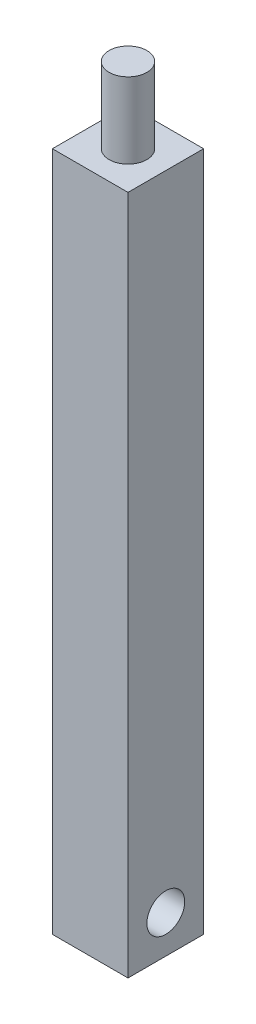
ISO-10303-21;
HEADER;
FILE_DESCRIPTION(('STEP AP214'),'2;1');
FILE_NAME('part.step','',(''),(''),'','','');
FILE_SCHEMA(('AUTOMOTIVE_DESIGN { 1 0 10303 214 1 1 1 1 }'));
ENDSEC;
DATA;
#1=APPLICATION_CONTEXT('core data for automotive mechanical design processes');
#2=APPLICATION_PROTOCOL_DEFINITION('international standard','automotive_design',2000,#1);
#3=PRODUCT_CONTEXT('',#1,'mechanical');
#4=PRODUCT('Part','Part','',(#3));
#5=PRODUCT_RELATED_PRODUCT_CATEGORY('part','',(#4));
#6=PRODUCT_DEFINITION_FORMATION('','',#4);
#7=PRODUCT_DEFINITION_CONTEXT('part definition',#1,'design');
#8=PRODUCT_DEFINITION('design','',#6,#7);
#9=PRODUCT_DEFINITION_SHAPE('','',#8);
#10=(LENGTH_UNIT() NAMED_UNIT(*) SI_UNIT(.MILLI.,.METRE.));
#11=(NAMED_UNIT(*) PLANE_ANGLE_UNIT() SI_UNIT($,.RADIAN.));
#12=(NAMED_UNIT(*) SI_UNIT($,.STERADIAN.) SOLID_ANGLE_UNIT());
#13=UNCERTAINTY_MEASURE_WITH_UNIT(LENGTH_MEASURE(1.E-05),#10,'distance_accuracy_value','');
#14=(GEOMETRIC_REPRESENTATION_CONTEXT(3) GLOBAL_UNCERTAINTY_ASSIGNED_CONTEXT((#13)) GLOBAL_UNIT_ASSIGNED_CONTEXT((#10,
#11,#12)) REPRESENTATION_CONTEXT('',''));
#15=CARTESIAN_POINT('',(0.,0.,0.));
#16=DIRECTION('',(0.,0.,1.));
#17=DIRECTION('',(1.,0.,0.));
#18=AXIS2_PLACEMENT_3D('',#15,#16,#17);
#19=CARTESIAN_POINT('',(5.,90.,-5.));
#20=DIRECTION('',(-1.,0.,0.));
#21=DIRECTION('',(0.,0.,1.));
#22=AXIS2_PLACEMENT_3D('',#19,#20,#21);
#23=PLANE('',#22);
#24=CARTESIAN_POINT('',(5.,5.,0.));
#25=DIRECTION('',(1.,0.,0.));
#26=DIRECTION('',(0.,0.,-1.));
#27=AXIS2_PLACEMENT_3D('',#24,#25,#26);
#28=CIRCLE('',#27,2.5);
#29=CARTESIAN_POINT('',(5.,5.,-2.5));
#30=VERTEX_POINT('',#29);
#31=EDGE_CURVE('E121',#30,#30,#28,.T.);
#32=ORIENTED_EDGE('',*,*,#31,.F.);
#33=EDGE_LOOP('',(#32));
#34=FACE_BOUND('',#33,.T.);
#35=DIRECTION('',(0.,0.,-1.));
#36=VECTOR('',#35,1.);
#37=CARTESIAN_POINT('',(5.,0.,-5.));
#38=LINE('',#37,#36);
#39=CARTESIAN_POINT('',(5.,0.,5.));
#40=VERTEX_POINT('',#39);
#41=CARTESIAN_POINT('',(5.,0.,-5.));
#42=VERTEX_POINT('',#41);
#43=EDGE_CURVE('E104',#40,#42,#38,.T.);
#44=ORIENTED_EDGE('',*,*,#43,.T.);
#45=DIRECTION('',(0.,-1.,0.));
#46=VECTOR('',#45,1.);
#47=CARTESIAN_POINT('',(5.,90.,-5.));
#48=LINE('',#47,#46);
#49=CARTESIAN_POINT('',(5.,90.,-5.));
#50=VERTEX_POINT('',#49);
#51=EDGE_CURVE('E41',#50,#42,#48,.T.);
#52=ORIENTED_EDGE('',*,*,#51,.F.);
#53=DIRECTION('',(0.,0.,-1.));
#54=VECTOR('',#53,1.);
#55=CARTESIAN_POINT('',(5.,90.,-5.));
#56=LINE('',#55,#54);
#57=CARTESIAN_POINT('',(5.,90.,5.));
#58=VERTEX_POINT('',#57);
#59=EDGE_CURVE('E91',#58,#50,#56,.T.);
#60=ORIENTED_EDGE('',*,*,#59,.F.);
#61=DIRECTION('',(0.,-1.,0.));
#62=VECTOR('',#61,1.);
#63=CARTESIAN_POINT('',(5.,90.,5.));
#64=LINE('',#63,#62);
#65=EDGE_CURVE('E100',#58,#40,#64,.T.);
#66=ORIENTED_EDGE('',*,*,#65,.T.);
#67=EDGE_LOOP('',(#44,#52,#60,#66));
#68=FACE_BOUND('',#67,.T.);
#69=ADVANCED_FACE('F38',(#34,#68),#23,.F.);
#70=CARTESIAN_POINT('',(-5.,90.,-5.));
#71=DIRECTION('',(0.,0.,1.));
#72=DIRECTION('',(1.,0.,0.));
#73=AXIS2_PLACEMENT_3D('',#70,#71,#72);
#74=PLANE('',#73);
#75=DIRECTION('',(-1.,0.,0.));
#76=VECTOR('',#75,1.);
#77=CARTESIAN_POINT('',(-5.,0.,-5.));
#78=LINE('',#77,#76);
#79=CARTESIAN_POINT('',(-5.,0.,-5.));
#80=VERTEX_POINT('',#79);
#81=EDGE_CURVE('E96',#42,#80,#78,.T.);
#82=ORIENTED_EDGE('',*,*,#81,.T.);
#83=DIRECTION('',(0.,-1.,0.));
#84=VECTOR('',#83,1.);
#85=CARTESIAN_POINT('',(-5.,90.,-5.));
#86=LINE('',#85,#84);
#87=CARTESIAN_POINT('',(-5.,90.,-5.));
#88=VERTEX_POINT('',#87);
#89=EDGE_CURVE('E94',#88,#80,#86,.T.);
#90=ORIENTED_EDGE('',*,*,#89,.F.);
#91=DIRECTION('',(-1.,0.,0.));
#92=VECTOR('',#91,1.);
#93=CARTESIAN_POINT('',(-5.,90.,-5.));
#94=LINE('',#93,#92);
#95=EDGE_CURVE('E86',#50,#88,#94,.T.);
#96=ORIENTED_EDGE('',*,*,#95,.F.);
#97=ORIENTED_EDGE('',*,*,#51,.T.);
#98=EDGE_LOOP('',(#82,#90,#96,#97));
#99=FACE_BOUND('',#98,.T.);
#100=ADVANCED_FACE('F95',(#99),#74,.F.);
#101=CARTESIAN_POINT('',(-5.,90.,-5.));
#102=DIRECTION('',(1.,0.,0.));
#103=DIRECTION('',(0.,0.,-1.));
#104=AXIS2_PLACEMENT_3D('',#101,#102,#103);
#105=PLANE('',#104);
#106=CARTESIAN_POINT('',(-5.,5.,0.));
#107=DIRECTION('',(1.,0.,0.));
#108=DIRECTION('',(0.,0.,-1.));
#109=AXIS2_PLACEMENT_3D('',#106,#107,#108);
#110=CIRCLE('',#109,2.5);
#111=CARTESIAN_POINT('',(-5.,5.,-2.5));
#112=VERTEX_POINT('',#111);
#113=EDGE_CURVE('E120',#112,#112,#110,.T.);
#114=ORIENTED_EDGE('',*,*,#113,.T.);
#115=EDGE_LOOP('',(#114));
#116=FACE_BOUND('',#115,.T.);
#117=DIRECTION('',(0.,0.,1.));
#118=VECTOR('',#117,1.);
#119=CARTESIAN_POINT('',(-5.,0.,-5.));
#120=LINE('',#119,#118);
#121=CARTESIAN_POINT('',(-5.,0.,5.));
#122=VERTEX_POINT('',#121);
#123=EDGE_CURVE('E72',#80,#122,#120,.T.);
#124=ORIENTED_EDGE('',*,*,#123,.T.);
#125=DIRECTION('',(0.,-1.,0.));
#126=VECTOR('',#125,1.);
#127=CARTESIAN_POINT('',(-5.,90.,5.));
#128=LINE('',#127,#126);
#129=CARTESIAN_POINT('',(-5.,90.,5.));
#130=VERTEX_POINT('',#129);
#131=EDGE_CURVE('E97',#130,#122,#128,.T.);
#132=ORIENTED_EDGE('',*,*,#131,.F.);
#133=DIRECTION('',(0.,0.,1.));
#134=VECTOR('',#133,1.);
#135=CARTESIAN_POINT('',(-5.,90.,-5.));
#136=LINE('',#135,#134);
#137=EDGE_CURVE('E89',#88,#130,#136,.T.);
#138=ORIENTED_EDGE('',*,*,#137,.F.);
#139=ORIENTED_EDGE('',*,*,#89,.T.);
#140=EDGE_LOOP('',(#124,#132,#138,#139));
#141=FACE_BOUND('',#140,.T.);
#142=ADVANCED_FACE('F98',(#116,#141),#105,.F.);
#143=CARTESIAN_POINT('',(-5.,90.,5.));
#144=DIRECTION('',(0.,0.,-1.));
#145=DIRECTION('',(-1.,0.,0.));
#146=AXIS2_PLACEMENT_3D('',#143,#144,#145);
#147=PLANE('',#146);
#148=DIRECTION('',(1.,0.,0.));
#149=VECTOR('',#148,1.);
#150=CARTESIAN_POINT('',(-5.,0.,5.));
#151=LINE('',#150,#149);
#152=EDGE_CURVE('E78',#122,#40,#151,.T.);
#153=ORIENTED_EDGE('',*,*,#152,.T.);
#154=ORIENTED_EDGE('',*,*,#65,.F.);
#155=DIRECTION('',(1.,0.,0.));
#156=VECTOR('',#155,1.);
#157=CARTESIAN_POINT('',(-5.,90.,5.));
#158=LINE('',#157,#156);
#159=EDGE_CURVE('E55',#130,#58,#158,.T.);
#160=ORIENTED_EDGE('',*,*,#159,.F.);
#161=ORIENTED_EDGE('',*,*,#131,.T.);
#162=EDGE_LOOP('',(#153,#154,#160,#161));
#163=FACE_BOUND('',#162,.T.);
#164=ADVANCED_FACE('F112',(#163),#147,.F.);
#165=CARTESIAN_POINT('',(0.,90.,0.));
#166=DIRECTION('',(0.,1.,0.));
#167=DIRECTION('',(0.,0.,1.));
#168=AXIS2_PLACEMENT_3D('',#165,#166,#167);
#169=PLANE('',#168);
#170=CARTESIAN_POINT('',(0.,90.,0.));
#171=DIRECTION('',(0.,1.,0.));
#172=DIRECTION('',(0.,0.,1.));
#173=AXIS2_PLACEMENT_3D('',#170,#171,#172);
#174=CIRCLE('',#173,2.5);
#175=CARTESIAN_POINT('',(0.,90.,2.5));
#176=VERTEX_POINT('',#175);
#177=EDGE_CURVE('E11',#176,#176,#174,.T.);
#178=ORIENTED_EDGE('',*,*,#177,.F.);
#179=EDGE_LOOP('',(#178));
#180=FACE_BOUND('',#179,.T.);
#181=ORIENTED_EDGE('',*,*,#59,.T.);
#182=ORIENTED_EDGE('',*,*,#95,.T.);
#183=ORIENTED_EDGE('',*,*,#137,.T.);
#184=ORIENTED_EDGE('',*,*,#159,.T.);
#185=EDGE_LOOP('',(#181,#182,#183,#184));
#186=FACE_BOUND('',#185,.T.);
#187=ADVANCED_FACE('F87',(#180,#186),#169,.T.);
#188=CARTESIAN_POINT('',(0.,0.,0.));
#189=DIRECTION('',(0.,1.,0.));
#190=DIRECTION('',(0.,0.,1.));
#191=AXIS2_PLACEMENT_3D('',#188,#189,#190);
#192=PLANE('',#191);
#193=ORIENTED_EDGE('',*,*,#43,.F.);
#194=ORIENTED_EDGE('',*,*,#152,.F.);
#195=ORIENTED_EDGE('',*,*,#123,.F.);
#196=ORIENTED_EDGE('',*,*,#81,.F.);
#197=EDGE_LOOP('',(#193,#194,#195,#196));
#198=FACE_BOUND('',#197,.T.);
#199=ADVANCED_FACE('F115',(#198),#192,.F.);
#200=CARTESIAN_POINT('',(0.,100.,0.));
#201=DIRECTION('',(0.,-1.,0.));
#202=DIRECTION('',(0.,0.,-1.));
#203=AXIS2_PLACEMENT_3D('',#200,#201,#202);
#204=CYLINDRICAL_SURFACE('',#203,2.5);
#205=CARTESIAN_POINT('',(0.,100.,0.));
#206=DIRECTION('',(0.,1.,0.));
#207=DIRECTION('',(0.,0.,1.));
#208=AXIS2_PLACEMENT_3D('',#205,#206,#207);
#209=CIRCLE('',#208,2.5);
#210=CARTESIAN_POINT('',(0.,100.,2.5));
#211=VERTEX_POINT('',#210);
#212=EDGE_CURVE('E107',#211,#211,#209,.T.);
#213=ORIENTED_EDGE('',*,*,#212,.F.);
#214=EDGE_LOOP('',(#213));
#215=FACE_BOUND('',#214,.T.);
#216=ORIENTED_EDGE('',*,*,#177,.T.);
#217=EDGE_LOOP('',(#216));
#218=FACE_BOUND('',#217,.T.);
#219=ADVANCED_FACE('F148',(#215,#218),#204,.T.);
#220=CARTESIAN_POINT('',(0.,100.,0.));
#221=DIRECTION('',(0.,1.,0.));
#222=DIRECTION('',(0.,0.,1.));
#223=AXIS2_PLACEMENT_3D('',#220,#221,#222);
#224=PLANE('',#223);
#225=ORIENTED_EDGE('',*,*,#212,.T.);
#226=EDGE_LOOP('',(#225));
#227=FACE_BOUND('',#226,.T.);
#228=ADVANCED_FACE('F131',(#227),#224,.T.);
#229=CARTESIAN_POINT('',(-5.,5.,0.));
#230=DIRECTION('',(1.,0.,0.));
#231=DIRECTION('',(0.,0.,-1.));
#232=AXIS2_PLACEMENT_3D('',#229,#230,#231);
#233=CYLINDRICAL_SURFACE('',#232,2.5);
#234=ORIENTED_EDGE('',*,*,#113,.F.);
#235=EDGE_LOOP('',(#234));
#236=FACE_BOUND('',#235,.T.);
#237=ORIENTED_EDGE('',*,*,#31,.T.);
#238=EDGE_LOOP('',(#237));
#239=FACE_BOUND('',#238,.T.);
#240=ADVANCED_FACE('F128',(#236,#239),#233,.F.);
#241=CLOSED_SHELL('',(#69,#100,#142,#164,#187,#199,#219,#228,#240));
#242=MANIFOLD_SOLID_BREP('B2',#241);
#243=ADVANCED_BREP_SHAPE_REPRESENTATION('',(#18,#242),#14);
#244=SHAPE_DEFINITION_REPRESENTATION(#9,#243);
ENDSEC;
END-ISO-10303-21;
